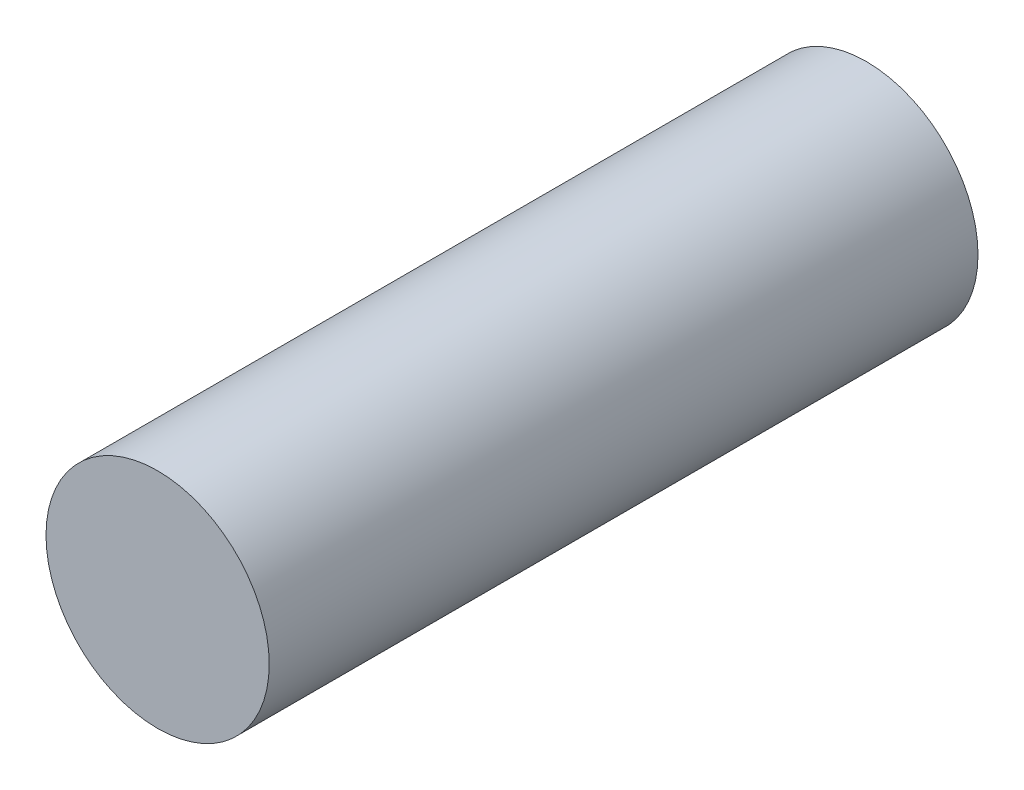
ISO-10303-21;
HEADER;
FILE_DESCRIPTION(('STEP AP214'),'2;1');
FILE_NAME('part.step','',(''),(''),'','','');
FILE_SCHEMA(('AUTOMOTIVE_DESIGN { 1 0 10303 214 1 1 1 1 }'));
ENDSEC;
DATA;
#1=APPLICATION_CONTEXT('core data for automotive mechanical design processes');
#2=APPLICATION_PROTOCOL_DEFINITION('international standard','automotive_design',2000,#1);
#3=PRODUCT_CONTEXT('',#1,'mechanical');
#4=PRODUCT('Part','Part','',(#3));
#5=PRODUCT_RELATED_PRODUCT_CATEGORY('part','',(#4));
#6=PRODUCT_DEFINITION_FORMATION('','',#4);
#7=PRODUCT_DEFINITION_CONTEXT('part definition',#1,'design');
#8=PRODUCT_DEFINITION('design','',#6,#7);
#9=PRODUCT_DEFINITION_SHAPE('','',#8);
#10=(LENGTH_UNIT() NAMED_UNIT(*) SI_UNIT(.MILLI.,.METRE.));
#11=(NAMED_UNIT(*) PLANE_ANGLE_UNIT() SI_UNIT($,.RADIAN.));
#12=(NAMED_UNIT(*) SI_UNIT($,.STERADIAN.) SOLID_ANGLE_UNIT());
#13=UNCERTAINTY_MEASURE_WITH_UNIT(LENGTH_MEASURE(1.E-05),#10,'distance_accuracy_value','');
#14=(GEOMETRIC_REPRESENTATION_CONTEXT(3) GLOBAL_UNCERTAINTY_ASSIGNED_CONTEXT((#13)) GLOBAL_UNIT_ASSIGNED_CONTEXT((#10,
#11,#12)) REPRESENTATION_CONTEXT('',''));
#15=CARTESIAN_POINT('',(0.,0.,0.));
#16=DIRECTION('',(0.,0.,1.));
#17=DIRECTION('',(1.,0.,0.));
#18=AXIS2_PLACEMENT_3D('',#15,#16,#17);
#19=CARTESIAN_POINT('',(0.,0.,9.525));
#20=DIRECTION('',(0.,0.,-1.));
#21=DIRECTION('',(-1.,0.,0.));
#22=AXIS2_PLACEMENT_3D('',#19,#20,#21);
#23=CYLINDRICAL_SURFACE('',#22,3.);
#24=CARTESIAN_POINT('',(0.,0.,9.525));
#25=DIRECTION('',(0.,0.,1.));
#26=DIRECTION('',(1.,0.,0.));
#27=AXIS2_PLACEMENT_3D('',#24,#25,#26);
#28=CIRCLE('',#27,3.);
#29=CARTESIAN_POINT('',(-3.,0.,9.525));
#30=VERTEX_POINT('',#29);
#31=EDGE_CURVE('E10',#30,#30,#28,.T.);
#32=CARTESIAN_POINT('',(0.,0.,-9.525));
#33=DIRECTION('',(0.,0.,1.));
#34=DIRECTION('',(1.,0.,0.));
#35=AXIS2_PLACEMENT_3D('',#32,#33,#34);
#36=CIRCLE('',#35,3.);
#37=CARTESIAN_POINT('',(-3.,0.,-9.525));
#38=VERTEX_POINT('',#37);
#39=EDGE_CURVE('E40',#38,#38,#36,.T.);
#40=CARTESIAN_POINT('',(-3.,0.,9.525));
#41=CARTESIAN_POINT('',(-3.,0.,9.3265625));
#42=CARTESIAN_POINT('',(-3.,0.,9.128125));
#43=CARTESIAN_POINT('',(-3.,0.,8.73125));
#44=CARTESIAN_POINT('',(-3.,0.,8.5328125));
#45=CARTESIAN_POINT('',(-3.,0.,8.1359375));
#46=CARTESIAN_POINT('',(-3.,0.,7.9375));
#47=CARTESIAN_POINT('',(-3.,0.,7.540625));
#48=CARTESIAN_POINT('',(-3.,0.,7.3421875));
#49=CARTESIAN_POINT('',(-3.,0.,6.9453125));
#50=CARTESIAN_POINT('',(-3.,0.,6.746875));
#51=CARTESIAN_POINT('',(-3.,0.,6.35));
#52=CARTESIAN_POINT('',(-3.,0.,6.1515625));
#53=CARTESIAN_POINT('',(-3.,0.,5.7546875));
#54=CARTESIAN_POINT('',(-3.,0.,5.55625));
#55=CARTESIAN_POINT('',(-3.,0.,5.159375));
#56=CARTESIAN_POINT('',(-3.,0.,4.9609375));
#57=CARTESIAN_POINT('',(-3.,0.,4.5640625));
#58=CARTESIAN_POINT('',(-3.,0.,4.365625));
#59=CARTESIAN_POINT('',(-3.,0.,3.96875));
#60=CARTESIAN_POINT('',(-3.,0.,3.7703125));
#61=CARTESIAN_POINT('',(-3.,0.,3.3734375));
#62=CARTESIAN_POINT('',(-3.,0.,3.175));
#63=CARTESIAN_POINT('',(-3.,0.,2.778125));
#64=CARTESIAN_POINT('',(-3.,0.,2.5796875));
#65=CARTESIAN_POINT('',(-3.,0.,2.1828125));
#66=CARTESIAN_POINT('',(-3.,0.,1.984375));
#67=CARTESIAN_POINT('',(-3.,0.,1.5875));
#68=CARTESIAN_POINT('',(-3.,0.,1.3890625));
#69=CARTESIAN_POINT('',(-3.,0.,0.992187499999999));
#70=CARTESIAN_POINT('',(-3.,0.,0.793749999999999));
#71=CARTESIAN_POINT('',(-3.,0.,0.396874999999998));
#72=CARTESIAN_POINT('',(-3.,0.,0.198437499999998));
#73=CARTESIAN_POINT('',(-3.,0.,-0.198437500000002));
#74=CARTESIAN_POINT('',(-3.,0.,-0.396875000000002));
#75=CARTESIAN_POINT('',(-3.,0.,-0.793750000000002));
#76=CARTESIAN_POINT('',(-3.,0.,-0.992187500000002));
#77=CARTESIAN_POINT('',(-3.,0.,-1.3890625));
#78=CARTESIAN_POINT('',(-3.,0.,-1.5875));
#79=CARTESIAN_POINT('',(-3.,0.,-1.984375));
#80=CARTESIAN_POINT('',(-3.,0.,-2.1828125));
#81=CARTESIAN_POINT('',(-3.,0.,-2.5796875));
#82=CARTESIAN_POINT('',(-3.,0.,-2.778125));
#83=CARTESIAN_POINT('',(-3.,0.,-3.175));
#84=CARTESIAN_POINT('',(-3.,0.,-3.3734375));
#85=CARTESIAN_POINT('',(-3.,0.,-3.7703125));
#86=CARTESIAN_POINT('',(-3.,0.,-3.96875));
#87=CARTESIAN_POINT('',(-3.,0.,-4.365625));
#88=CARTESIAN_POINT('',(-3.,0.,-4.5640625));
#89=CARTESIAN_POINT('',(-3.,0.,-4.9609375));
#90=CARTESIAN_POINT('',(-3.,0.,-5.159375));
#91=CARTESIAN_POINT('',(-3.,0.,-5.55625));
#92=CARTESIAN_POINT('',(-3.,0.,-5.7546875));
#93=CARTESIAN_POINT('',(-3.,0.,-6.1515625));
#94=CARTESIAN_POINT('',(-3.,0.,-6.35));
#95=CARTESIAN_POINT('',(-3.,0.,-6.746875));
#96=CARTESIAN_POINT('',(-3.,0.,-6.9453125));
#97=CARTESIAN_POINT('',(-3.,0.,-7.3421875));
#98=CARTESIAN_POINT('',(-3.,0.,-7.540625));
#99=CARTESIAN_POINT('',(-3.,0.,-7.9375));
#100=CARTESIAN_POINT('',(-3.,0.,-8.1359375));
#101=CARTESIAN_POINT('',(-3.,0.,-8.5328125));
#102=CARTESIAN_POINT('',(-3.,0.,-8.73125));
#103=CARTESIAN_POINT('',(-3.,0.,-9.128125));
#104=CARTESIAN_POINT('',(-3.,0.,-9.3265625));
#105=CARTESIAN_POINT('',(-3.,0.,-9.525));
#106=B_SPLINE_CURVE_WITH_KNOTS('',3,(#40,#41,#42,#43,#44,#45,#46,#47,#48,#49,#50,#51,#52,#53,
#54,#55,#56,#57,#58,#59,#60,#61,#62,#63,#64,#65,#66,#67,#68,#69,#70,#71,#72,#73,#74,#75,#76,#77,
#78,#79,#80,#81,#82,#83,#84,#85,#86,#87,#88,#89,#90,#91,#92,#93,#94,#95,#96,#97,#98,#99,#100,
#101,#102,#103,#104,#105),.UNSPECIFIED.,.F.,.F.,(4,2,2,2,2,2,2,2,2,2,2,2,2,2,2,2,2,2,2,2,2,2,2,
2,2,2,2,2,2,2,2,2,4),(0.,0.595312499999999,1.190625,1.7859375,2.38125,2.9765625,3.571875,
4.1671875,4.7625,5.3578125,5.953125,6.5484375,7.14375,7.7390625,8.334375,8.9296875,9.525,
10.1203125,10.715625,11.3109375,11.90625,12.5015625,13.096875,13.6921875,14.2875,14.8828125,
15.478125,16.0734375,16.66875,17.2640625,17.859375,18.4546875,19.05),.UNSPECIFIED.);
#107=EDGE_CURVE('BSEAM37',#30,#38,#106,.T.);
#108=ORIENTED_EDGE('',*,*,#31,.F.);
#109=ORIENTED_EDGE('',*,*,#39,.T.);
#110=ORIENTED_EDGE('',*,*,#107,.T.);
#111=ORIENTED_EDGE('',*,*,#107,.F.);
#112=EDGE_LOOP('',(#108,#110,#109,#111));
#113=FACE_BOUND('',#112,.T.);
#114=ADVANCED_FACE('F37',(#113),#23,.T.);
#115=CARTESIAN_POINT('',(0.,0.,9.525));
#116=DIRECTION('',(0.,0.,1.));
#117=DIRECTION('',(1.,0.,0.));
#118=AXIS2_PLACEMENT_3D('',#115,#116,#117);
#119=PLANE('',#118);
#120=ORIENTED_EDGE('',*,*,#31,.T.);
#121=EDGE_LOOP('',(#120));
#122=FACE_BOUND('',#121,.T.);
#123=ADVANCED_FACE('F54',(#122),#119,.T.);
#124=CARTESIAN_POINT('',(0.,0.,-9.525));
#125=DIRECTION('',(0.,0.,1.));
#126=DIRECTION('',(1.,0.,0.));
#127=AXIS2_PLACEMENT_3D('',#124,#125,#126);
#128=PLANE('',#127);
#129=ORIENTED_EDGE('',*,*,#39,.F.);
#130=EDGE_LOOP('',(#129));
#131=FACE_BOUND('',#130,.T.);
#132=ADVANCED_FACE('F52',(#131),#128,.F.);
#133=CLOSED_SHELL('',(#114,#123,#132));
#134=MANIFOLD_SOLID_BREP('B2',#133);
#135=ADVANCED_BREP_SHAPE_REPRESENTATION('',(#18,#134),#14);
#136=SHAPE_DEFINITION_REPRESENTATION(#9,#135);
ENDSEC;
END-ISO-10303-21;
